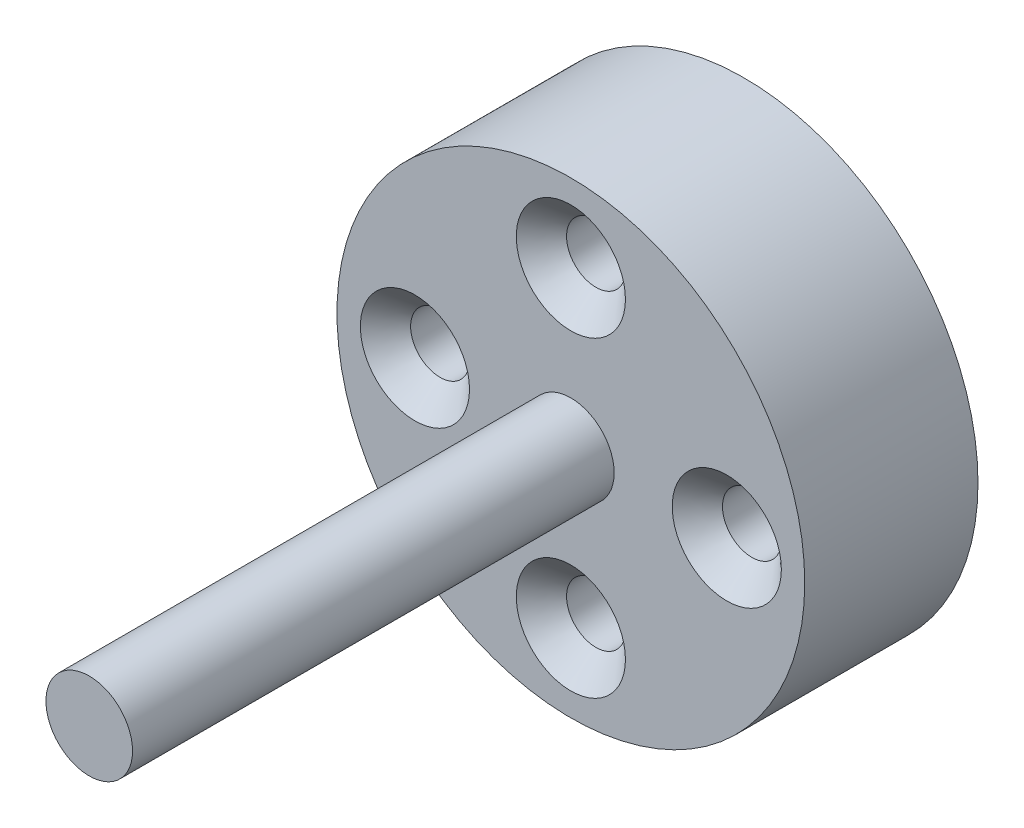
ISO-10303-21;
HEADER;
FILE_DESCRIPTION(('STEP AP214'),'2;1');
FILE_NAME('part.step','',(''),(''),'','','');
FILE_SCHEMA(('AUTOMOTIVE_DESIGN { 1 0 10303 214 1 1 1 1 }'));
ENDSEC;
DATA;
#1=APPLICATION_CONTEXT('core data for automotive mechanical design processes');
#2=APPLICATION_PROTOCOL_DEFINITION('international standard','automotive_design',2000,#1);
#3=PRODUCT_CONTEXT('',#1,'mechanical');
#4=PRODUCT('Part','Part','',(#3));
#5=PRODUCT_RELATED_PRODUCT_CATEGORY('part','',(#4));
#6=PRODUCT_DEFINITION_FORMATION('','',#4);
#7=PRODUCT_DEFINITION_CONTEXT('part definition',#1,'design');
#8=PRODUCT_DEFINITION('design','',#6,#7);
#9=PRODUCT_DEFINITION_SHAPE('','',#8);
#10=(LENGTH_UNIT() NAMED_UNIT(*) SI_UNIT(.MILLI.,.METRE.));
#11=(NAMED_UNIT(*) PLANE_ANGLE_UNIT() SI_UNIT($,.RADIAN.));
#12=(NAMED_UNIT(*) SI_UNIT($,.STERADIAN.) SOLID_ANGLE_UNIT());
#13=UNCERTAINTY_MEASURE_WITH_UNIT(LENGTH_MEASURE(1.E-05),#10,'distance_accuracy_value','');
#14=(GEOMETRIC_REPRESENTATION_CONTEXT(3) GLOBAL_UNCERTAINTY_ASSIGNED_CONTEXT((#13)) GLOBAL_UNIT_ASSIGNED_CONTEXT((#10,
#11,#12)) REPRESENTATION_CONTEXT('',''));
#15=CARTESIAN_POINT('',(0.,0.,0.));
#16=DIRECTION('',(0.,0.,1.));
#17=DIRECTION('',(1.,0.,0.));
#18=AXIS2_PLACEMENT_3D('',#15,#16,#17);
#19=CARTESIAN_POINT('',(0.,0.,0.));
#20=DIRECTION('',(0.,0.,1.));
#21=DIRECTION('',(1.,0.,0.));
#22=AXIS2_PLACEMENT_3D('',#19,#20,#21);
#23=PLANE('',#22);
#24=CARTESIAN_POINT('',(9.,0.,0.));
#25=DIRECTION('',(0.,0.,1.));
#26=DIRECTION('',(1.,0.,0.));
#27=AXIS2_PLACEMENT_3D('',#24,#25,#26);
#28=CIRCLE('',#27,1.7);
#29=CARTESIAN_POINT('',(10.7,0.,0.));
#30=VERTEX_POINT('',#29);
#31=EDGE_CURVE('E77',#30,#30,#28,.F.);
#32=ORIENTED_EDGE('',*,*,#31,.F.);
#33=EDGE_LOOP('',(#32));
#34=FACE_BOUND('',#33,.T.);
#35=CARTESIAN_POINT('',(0.,0.,0.));
#36=DIRECTION('',(0.,0.,1.));
#37=DIRECTION('',(1.,0.,0.));
#38=AXIS2_PLACEMENT_3D('',#35,#36,#37);
#39=CIRCLE('',#38,13.5);
#40=CARTESIAN_POINT('',(13.5,0.,0.));
#41=VERTEX_POINT('',#40);
#42=EDGE_CURVE('E41',#41,#41,#39,.T.);
#43=ORIENTED_EDGE('',*,*,#42,.F.);
#44=EDGE_LOOP('',(#43));
#45=FACE_BOUND('',#44,.T.);
#46=CARTESIAN_POINT('',(0.,0.,0.));
#47=DIRECTION('',(0.,0.,-1.));
#48=DIRECTION('',(-1.,0.,0.));
#49=AXIS2_PLACEMENT_3D('',#46,#47,#48);
#50=CIRCLE('',#49,2.3);
#51=CARTESIAN_POINT('',(-2.3,0.,0.));
#52=VERTEX_POINT('',#51);
#53=EDGE_CURVE('E56',#52,#52,#50,.T.);
#54=ORIENTED_EDGE('',*,*,#53,.F.);
#55=EDGE_LOOP('',(#54));
#56=FACE_BOUND('',#55,.T.);
#57=CARTESIAN_POINT('',(0.,-9.,0.));
#58=DIRECTION('',(0.,0.,1.));
#59=DIRECTION('',(1.,0.,0.));
#60=AXIS2_PLACEMENT_3D('',#57,#58,#59);
#61=CIRCLE('',#60,1.7);
#62=CARTESIAN_POINT('',(1.7,-9.,0.));
#63=VERTEX_POINT('',#62);
#64=EDGE_CURVE('E59',#63,#63,#61,.F.);
#65=ORIENTED_EDGE('',*,*,#64,.F.);
#66=EDGE_LOOP('',(#65));
#67=FACE_BOUND('',#66,.T.);
#68=CARTESIAN_POINT('',(-9.,0.,0.));
#69=DIRECTION('',(0.,0.,1.));
#70=DIRECTION('',(1.,0.,0.));
#71=AXIS2_PLACEMENT_3D('',#68,#69,#70);
#72=CIRCLE('',#71,1.7);
#73=CARTESIAN_POINT('',(-7.3,0.,0.));
#74=VERTEX_POINT('',#73);
#75=EDGE_CURVE('E68',#74,#74,#72,.F.);
#76=ORIENTED_EDGE('',*,*,#75,.F.);
#77=EDGE_LOOP('',(#76));
#78=FACE_BOUND('',#77,.T.);
#79=CARTESIAN_POINT('',(0.,9.,0.));
#80=DIRECTION('',(0.,0.,1.));
#81=DIRECTION('',(1.,0.,0.));
#82=AXIS2_PLACEMENT_3D('',#79,#80,#81);
#83=CIRCLE('',#82,1.7);
#84=CARTESIAN_POINT('',(1.7,9.,0.));
#85=VERTEX_POINT('',#84);
#86=EDGE_CURVE('E86',#85,#85,#83,.F.);
#87=ORIENTED_EDGE('',*,*,#86,.F.);
#88=EDGE_LOOP('',(#87));
#89=FACE_BOUND('',#88,.T.);
#90=ADVANCED_FACE('F37',(#34,#45,#56,#67,#78,#89),#23,.F.);
#91=CARTESIAN_POINT('',(0.,0.,10.));
#92=DIRECTION('',(0.,0.,-1.));
#93=DIRECTION('',(-1.,0.,0.));
#94=AXIS2_PLACEMENT_3D('',#91,#92,#93);
#95=CYLINDRICAL_SURFACE('',#94,13.5);
#96=CARTESIAN_POINT('',(0.,0.,10.));
#97=DIRECTION('',(0.,0.,1.));
#98=DIRECTION('',(1.,0.,0.));
#99=AXIS2_PLACEMENT_3D('',#96,#97,#98);
#100=CIRCLE('',#99,13.5);
#101=CARTESIAN_POINT('',(13.5,0.,10.));
#102=VERTEX_POINT('',#101);
#103=EDGE_CURVE('E10',#102,#102,#100,.T.);
#104=ORIENTED_EDGE('',*,*,#103,.F.);
#105=EDGE_LOOP('',(#104));
#106=FACE_BOUND('',#105,.T.);
#107=ORIENTED_EDGE('',*,*,#42,.T.);
#108=EDGE_LOOP('',(#107));
#109=FACE_BOUND('',#108,.T.);
#110=ADVANCED_FACE('F39',(#106,#109),#95,.T.);
#111=CARTESIAN_POINT('',(0.,0.,10.));
#112=DIRECTION('',(0.,0.,1.));
#113=DIRECTION('',(1.,0.,0.));
#114=AXIS2_PLACEMENT_3D('',#111,#112,#113);
#115=PLANE('',#114);
#116=CARTESIAN_POINT('',(0.,9.,10.));
#117=DIRECTION('',(0.,0.,1.));
#118=DIRECTION('',(1.,0.,0.));
#119=AXIS2_PLACEMENT_3D('',#116,#117,#118);
#120=CIRCLE('',#119,3.15);
#121=CARTESIAN_POINT('',(3.15,9.,10.));
#122=VERTEX_POINT('',#121);
#123=EDGE_CURVE('E92',#122,#122,#120,.T.);
#124=ORIENTED_EDGE('',*,*,#123,.F.);
#125=EDGE_LOOP('',(#124));
#126=FACE_BOUND('',#125,.T.);
#127=CARTESIAN_POINT('',(9.,0.,10.));
#128=DIRECTION('',(0.,0.,1.));
#129=DIRECTION('',(1.,0.,0.));
#130=AXIS2_PLACEMENT_3D('',#127,#128,#129);
#131=CIRCLE('',#130,3.15);
#132=CARTESIAN_POINT('',(12.15,0.,10.));
#133=VERTEX_POINT('',#132);
#134=EDGE_CURVE('E83',#133,#133,#131,.T.);
#135=ORIENTED_EDGE('',*,*,#134,.F.);
#136=EDGE_LOOP('',(#135));
#137=FACE_BOUND('',#136,.T.);
#138=CARTESIAN_POINT('',(-9.,0.,10.));
#139=DIRECTION('',(0.,0.,1.));
#140=DIRECTION('',(1.,0.,0.));
#141=AXIS2_PLACEMENT_3D('',#138,#139,#140);
#142=CIRCLE('',#141,3.15);
#143=CARTESIAN_POINT('',(-5.85,0.,10.));
#144=VERTEX_POINT('',#143);
#145=EDGE_CURVE('E74',#144,#144,#142,.T.);
#146=ORIENTED_EDGE('',*,*,#145,.F.);
#147=EDGE_LOOP('',(#146));
#148=FACE_BOUND('',#147,.T.);
#149=CARTESIAN_POINT('',(0.,-9.,10.));
#150=DIRECTION('',(0.,0.,1.));
#151=DIRECTION('',(1.,0.,0.));
#152=AXIS2_PLACEMENT_3D('',#149,#150,#151);
#153=CIRCLE('',#152,3.15);
#154=CARTESIAN_POINT('',(3.15,-9.,10.));
#155=VERTEX_POINT('',#154);
#156=EDGE_CURVE('E65',#155,#155,#153,.T.);
#157=ORIENTED_EDGE('',*,*,#156,.F.);
#158=EDGE_LOOP('',(#157));
#159=FACE_BOUND('',#158,.T.);
#160=CARTESIAN_POINT('',(0.,0.,10.));
#161=DIRECTION('',(0.,0.,1.));
#162=DIRECTION('',(1.,0.,0.));
#163=AXIS2_PLACEMENT_3D('',#160,#161,#162);
#164=CIRCLE('',#163,2.5);
#165=CARTESIAN_POINT('',(2.5,0.,10.));
#166=VERTEX_POINT('',#165);
#167=EDGE_CURVE('E50',#166,#166,#164,.T.);
#168=ORIENTED_EDGE('',*,*,#167,.F.);
#169=EDGE_LOOP('',(#168));
#170=FACE_BOUND('',#169,.T.);
#171=ORIENTED_EDGE('',*,*,#103,.T.);
#172=EDGE_LOOP('',(#171));
#173=FACE_BOUND('',#172,.T.);
#174=ADVANCED_FACE('F106',(#126,#137,#148,#159,#170,#173),#115,.T.);
#175=CARTESIAN_POINT('',(0.,0.,37.8));
#176=DIRECTION('',(0.,0.,-1.));
#177=DIRECTION('',(-1.,0.,0.));
#178=AXIS2_PLACEMENT_3D('',#175,#176,#177);
#179=CYLINDRICAL_SURFACE('',#178,2.5);
#180=CARTESIAN_POINT('',(0.,0.,37.8));
#181=DIRECTION('',(0.,0.,1.));
#182=DIRECTION('',(1.,0.,0.));
#183=AXIS2_PLACEMENT_3D('',#180,#181,#182);
#184=CIRCLE('',#183,2.5);
#185=CARTESIAN_POINT('',(2.5,0.,37.8));
#186=VERTEX_POINT('',#185);
#187=EDGE_CURVE('E48',#186,#186,#184,.T.);
#188=ORIENTED_EDGE('',*,*,#187,.F.);
#189=EDGE_LOOP('',(#188));
#190=FACE_BOUND('',#189,.T.);
#191=ORIENTED_EDGE('',*,*,#167,.T.);
#192=EDGE_LOOP('',(#191));
#193=FACE_BOUND('',#192,.T.);
#194=ADVANCED_FACE('F113',(#190,#193),#179,.T.);
#195=CARTESIAN_POINT('',(0.,0.,37.8));
#196=DIRECTION('',(0.,0.,1.));
#197=DIRECTION('',(1.,0.,0.));
#198=AXIS2_PLACEMENT_3D('',#195,#196,#197);
#199=PLANE('',#198);
#200=ORIENTED_EDGE('',*,*,#187,.T.);
#201=EDGE_LOOP('',(#200));
#202=FACE_BOUND('',#201,.T.);
#203=ADVANCED_FACE('F117',(#202),#199,.T.);
#204=CARTESIAN_POINT('',(0.,0.,6.));
#205=DIRECTION('',(0.,0.,-1.));
#206=DIRECTION('',(-1.,0.,0.));
#207=AXIS2_PLACEMENT_3D('',#204,#205,#206);
#208=CYLINDRICAL_SURFACE('',#207,2.3);
#209=CARTESIAN_POINT('',(0.,0.,6.));
#210=DIRECTION('',(0.,0.,-1.));
#211=DIRECTION('',(-1.,0.,0.));
#212=AXIS2_PLACEMENT_3D('',#209,#210,#211);
#213=CIRCLE('',#212,2.3);
#214=CARTESIAN_POINT('',(-2.3,0.,6.));
#215=VERTEX_POINT('',#214);
#216=EDGE_CURVE('E53',#215,#215,#213,.T.);
#217=ORIENTED_EDGE('',*,*,#216,.F.);
#218=EDGE_LOOP('',(#217));
#219=FACE_BOUND('',#218,.T.);
#220=ORIENTED_EDGE('',*,*,#53,.T.);
#221=EDGE_LOOP('',(#220));
#222=FACE_BOUND('',#221,.T.);
#223=ADVANCED_FACE('F121',(#219,#222),#208,.F.);
#224=CARTESIAN_POINT('',(0.,0.,6.));
#225=DIRECTION('',(0.,0.,-1.));
#226=DIRECTION('',(-1.,0.,0.));
#227=AXIS2_PLACEMENT_3D('',#224,#225,#226);
#228=PLANE('',#227);
#229=ORIENTED_EDGE('',*,*,#216,.T.);
#230=EDGE_LOOP('',(#229));
#231=FACE_BOUND('',#230,.T.);
#232=ADVANCED_FACE('F125',(#231),#228,.T.);
#233=CARTESIAN_POINT('',(0.,-9.,10.));
#234=DIRECTION('',(0.,0.,1.));
#235=DIRECTION('',(1.,0.,0.));
#236=AXIS2_PLACEMENT_3D('',#233,#234,#235);
#237=CYLINDRICAL_SURFACE('',#236,1.7);
#238=ORIENTED_EDGE('',*,*,#64,.T.);
#239=EDGE_LOOP('',(#238));
#240=FACE_BOUND('',#239,.T.);
#241=CARTESIAN_POINT('',(0.,-9.,8.55));
#242=DIRECTION('',(0.,0.,1.));
#243=DIRECTION('',(1.,0.,0.));
#244=AXIS2_PLACEMENT_3D('',#241,#242,#243);
#245=CIRCLE('',#244,1.7);
#246=CARTESIAN_POINT('',(1.7,-9.,8.55));
#247=VERTEX_POINT('',#246);
#248=EDGE_CURVE('E62',#247,#247,#245,.T.);
#249=ORIENTED_EDGE('',*,*,#248,.T.);
#250=EDGE_LOOP('',(#249));
#251=FACE_BOUND('',#250,.T.);
#252=ADVANCED_FACE('F129',(#240,#251),#237,.F.);
#253=CARTESIAN_POINT('',(0.,-9.,10.));
#254=DIRECTION('',(0.,0.,1.));
#255=DIRECTION('',(1.,0.,0.));
#256=AXIS2_PLACEMENT_3D('',#253,#254,#255);
#257=CONICAL_SURFACE('',#256,3.15,0.785398163397448);
#258=ORIENTED_EDGE('',*,*,#248,.F.);
#259=EDGE_LOOP('',(#258));
#260=FACE_BOUND('',#259,.T.);
#261=ORIENTED_EDGE('',*,*,#156,.T.);
#262=EDGE_LOOP('',(#261));
#263=FACE_BOUND('',#262,.T.);
#264=ADVANCED_FACE('F133',(#260,#263),#257,.F.);
#265=CARTESIAN_POINT('',(-9.,0.,10.));
#266=DIRECTION('',(0.,0.,1.));
#267=DIRECTION('',(1.,0.,0.));
#268=AXIS2_PLACEMENT_3D('',#265,#266,#267);
#269=CYLINDRICAL_SURFACE('',#268,1.7);
#270=ORIENTED_EDGE('',*,*,#75,.T.);
#271=EDGE_LOOP('',(#270));
#272=FACE_BOUND('',#271,.T.);
#273=CARTESIAN_POINT('',(-9.,0.,8.55));
#274=DIRECTION('',(0.,0.,1.));
#275=DIRECTION('',(1.,0.,0.));
#276=AXIS2_PLACEMENT_3D('',#273,#274,#275);
#277=CIRCLE('',#276,1.7);
#278=CARTESIAN_POINT('',(-7.3,0.,8.55));
#279=VERTEX_POINT('',#278);
#280=EDGE_CURVE('E71',#279,#279,#277,.T.);
#281=ORIENTED_EDGE('',*,*,#280,.T.);
#282=EDGE_LOOP('',(#281));
#283=FACE_BOUND('',#282,.T.);
#284=ADVANCED_FACE('F137',(#272,#283),#269,.F.);
#285=CARTESIAN_POINT('',(-9.,0.,10.));
#286=DIRECTION('',(0.,0.,1.));
#287=DIRECTION('',(1.,0.,0.));
#288=AXIS2_PLACEMENT_3D('',#285,#286,#287);
#289=CONICAL_SURFACE('',#288,3.15,0.785398163397448);
#290=ORIENTED_EDGE('',*,*,#280,.F.);
#291=EDGE_LOOP('',(#290));
#292=FACE_BOUND('',#291,.T.);
#293=ORIENTED_EDGE('',*,*,#145,.T.);
#294=EDGE_LOOP('',(#293));
#295=FACE_BOUND('',#294,.T.);
#296=ADVANCED_FACE('F141',(#292,#295),#289,.F.);
#297=CARTESIAN_POINT('',(9.,0.,10.));
#298=DIRECTION('',(0.,0.,1.));
#299=DIRECTION('',(1.,0.,0.));
#300=AXIS2_PLACEMENT_3D('',#297,#298,#299);
#301=CYLINDRICAL_SURFACE('',#300,1.7);
#302=ORIENTED_EDGE('',*,*,#31,.T.);
#303=EDGE_LOOP('',(#302));
#304=FACE_BOUND('',#303,.T.);
#305=CARTESIAN_POINT('',(9.,0.,8.55));
#306=DIRECTION('',(0.,0.,1.));
#307=DIRECTION('',(1.,0.,0.));
#308=AXIS2_PLACEMENT_3D('',#305,#306,#307);
#309=CIRCLE('',#308,1.7);
#310=CARTESIAN_POINT('',(10.7,0.,8.55));
#311=VERTEX_POINT('',#310);
#312=EDGE_CURVE('E80',#311,#311,#309,.T.);
#313=ORIENTED_EDGE('',*,*,#312,.T.);
#314=EDGE_LOOP('',(#313));
#315=FACE_BOUND('',#314,.T.);
#316=ADVANCED_FACE('F145',(#304,#315),#301,.F.);
#317=CARTESIAN_POINT('',(9.,0.,10.));
#318=DIRECTION('',(0.,0.,1.));
#319=DIRECTION('',(1.,0.,0.));
#320=AXIS2_PLACEMENT_3D('',#317,#318,#319);
#321=CONICAL_SURFACE('',#320,3.15,0.785398163397448);
#322=ORIENTED_EDGE('',*,*,#312,.F.);
#323=EDGE_LOOP('',(#322));
#324=FACE_BOUND('',#323,.T.);
#325=ORIENTED_EDGE('',*,*,#134,.T.);
#326=EDGE_LOOP('',(#325));
#327=FACE_BOUND('',#326,.T.);
#328=ADVANCED_FACE('F149',(#324,#327),#321,.F.);
#329=CARTESIAN_POINT('',(0.,9.,10.));
#330=DIRECTION('',(0.,0.,1.));
#331=DIRECTION('',(1.,0.,0.));
#332=AXIS2_PLACEMENT_3D('',#329,#330,#331);
#333=CYLINDRICAL_SURFACE('',#332,1.7);
#334=ORIENTED_EDGE('',*,*,#86,.T.);
#335=EDGE_LOOP('',(#334));
#336=FACE_BOUND('',#335,.T.);
#337=CARTESIAN_POINT('',(0.,9.,8.55));
#338=DIRECTION('',(0.,0.,1.));
#339=DIRECTION('',(1.,0.,0.));
#340=AXIS2_PLACEMENT_3D('',#337,#338,#339);
#341=CIRCLE('',#340,1.7);
#342=CARTESIAN_POINT('',(1.7,9.,8.55));
#343=VERTEX_POINT('',#342);
#344=EDGE_CURVE('E89',#343,#343,#341,.T.);
#345=ORIENTED_EDGE('',*,*,#344,.T.);
#346=EDGE_LOOP('',(#345));
#347=FACE_BOUND('',#346,.T.);
#348=ADVANCED_FACE('F98',(#336,#347),#333,.F.);
#349=CARTESIAN_POINT('',(0.,9.,10.));
#350=DIRECTION('',(0.,0.,1.));
#351=DIRECTION('',(1.,0.,0.));
#352=AXIS2_PLACEMENT_3D('',#349,#350,#351);
#353=CONICAL_SURFACE('',#352,3.15,0.785398163397448);
#354=ORIENTED_EDGE('',*,*,#344,.F.);
#355=EDGE_LOOP('',(#354));
#356=FACE_BOUND('',#355,.T.);
#357=ORIENTED_EDGE('',*,*,#123,.T.);
#358=EDGE_LOOP('',(#357));
#359=FACE_BOUND('',#358,.T.);
#360=ADVANCED_FACE('F156',(#356,#359),#353,.F.);
#361=CLOSED_SHELL('',(#90,#110,#174,#194,#203,#223,#232,#252,#264,#284,#296,#316,#328,#348,#360));
#362=MANIFOLD_SOLID_BREP('B2',#361);
#363=ADVANCED_BREP_SHAPE_REPRESENTATION('',(#18,#362),#14);
#364=SHAPE_DEFINITION_REPRESENTATION(#9,#363);
ENDSEC;
END-ISO-10303-21;
